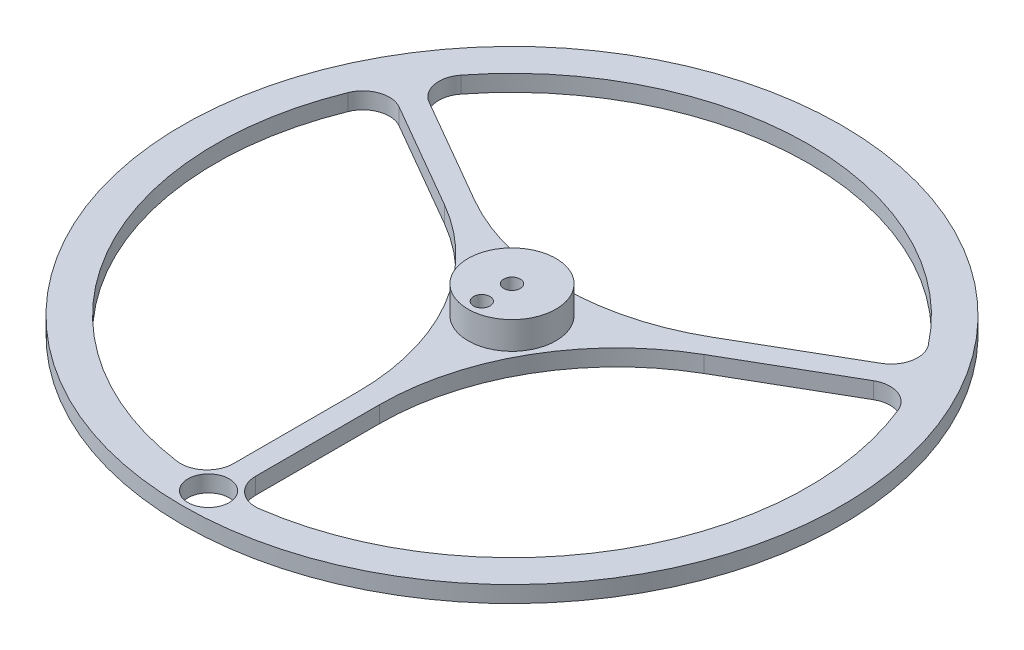
ISO-10303-21;
HEADER;
FILE_DESCRIPTION(('STEP AP214'),'2;1');
FILE_NAME('part.step','',(''),(''),'','','');
FILE_SCHEMA(('AUTOMOTIVE_DESIGN { 1 0 10303 214 1 1 1 1 }'));
ENDSEC;
DATA;
#1=APPLICATION_CONTEXT('core data for automotive mechanical design processes');
#2=APPLICATION_PROTOCOL_DEFINITION('international standard','automotive_design',2000,#1);
#3=PRODUCT_CONTEXT('',#1,'mechanical');
#4=PRODUCT('Part','Part','',(#3));
#5=PRODUCT_RELATED_PRODUCT_CATEGORY('part','',(#4));
#6=PRODUCT_DEFINITION_FORMATION('','',#4);
#7=PRODUCT_DEFINITION_CONTEXT('part definition',#1,'design');
#8=PRODUCT_DEFINITION('design','',#6,#7);
#9=PRODUCT_DEFINITION_SHAPE('','',#8);
#10=(LENGTH_UNIT() NAMED_UNIT(*) SI_UNIT(.MILLI.,.METRE.));
#11=(NAMED_UNIT(*) PLANE_ANGLE_UNIT() SI_UNIT($,.RADIAN.));
#12=(NAMED_UNIT(*) SI_UNIT($,.STERADIAN.) SOLID_ANGLE_UNIT());
#13=UNCERTAINTY_MEASURE_WITH_UNIT(LENGTH_MEASURE(1.E-05),#10,'distance_accuracy_value','');
#14=(GEOMETRIC_REPRESENTATION_CONTEXT(3) GLOBAL_UNCERTAINTY_ASSIGNED_CONTEXT((#13)) GLOBAL_UNIT_ASSIGNED_CONTEXT((#10,
#11,#12)) REPRESENTATION_CONTEXT('',''));
#15=CARTESIAN_POINT('',(0.,0.,0.));
#16=DIRECTION('',(0.,0.,1.));
#17=DIRECTION('',(1.,0.,0.));
#18=AXIS2_PLACEMENT_3D('',#15,#16,#17);
#19=CARTESIAN_POINT('',(-132.141421356237,0.,0.));
#20=DIRECTION('',(0.,1.,0.));
#21=DIRECTION('',(0.,0.,1.));
#22=AXIS2_PLACEMENT_3D('',#19,#20,#21);
#23=PLANE('',#22);
#24=CARTESIAN_POINT('',(0.,0.,55.25));
#25=DIRECTION('',(0.,1.,0.));
#26=DIRECTION('',(0.,0.,1.));
#27=AXIS2_PLACEMENT_3D('',#24,#25,#26);
#28=CIRCLE('',#27,3.75);
#29=CARTESIAN_POINT('',(0.,0.,59.));
#30=VERTEX_POINT('',#29);
#31=EDGE_CURVE('E511',#30,#30,#28,.T.);
#32=ORIENTED_EDGE('',*,*,#31,.F.);
#33=EDGE_LOOP('',(#32));
#34=FACE_BOUND('',#33,.T.);
#35=CARTESIAN_POINT('',(0.,0.,0.));
#36=DIRECTION('',(0.,1.,0.));
#37=DIRECTION('',(0.,0.,1.));
#38=AXIS2_PLACEMENT_3D('',#35,#36,#37);
#39=CIRCLE('',#38,60.);
#40=CARTESIAN_POINT('',(0.,0.,60.));
#41=VERTEX_POINT('',#40);
#42=EDGE_CURVE('E251',#41,#41,#39,.T.);
#43=ORIENTED_EDGE('',*,*,#42,.T.);
#44=EDGE_LOOP('',(#43));
#45=FACE_BOUND('',#44,.T.);
#46=CARTESIAN_POINT('',(0.,0.,0.));
#47=DIRECTION('',(0.,1.,0.));
#48=DIRECTION('',(0.,0.,1.));
#49=AXIS2_PLACEMENT_3D('',#46,#47,#48);
#50=CIRCLE('',#49,54.);
#51=CARTESIAN_POINT('',(-50.0621204437888,0.,-20.2431246765806));
#52=VERTEX_POINT('',#51);
#53=CARTESIAN_POINT('',(-7.5,0.,53.4766304099277));
#54=VERTEX_POINT('',#53);
#55=EDGE_CURVE('E214',#52,#54,#50,.T.);
#56=ORIENTED_EDGE('',*,*,#55,.F.);
#57=CARTESIAN_POINT('',(-45.5850204078836,0.,-18.4327640004259));
#58=DIRECTION('',(0.,1.,0.));
#59=DIRECTION('',(0.,0.,1.));
#60=AXIS2_PLACEMENT_3D('',#57,#58,#59);
#61=CIRCLE('',#60,4.82926811321019);
#62=CARTESIAN_POINT('',(-43.1703863512785,0.,-22.6150328681521));
#63=VERTEX_POINT('',#62);
#64=EDGE_CURVE('E240',#63,#52,#61,.T.);
#65=ORIENTED_EDGE('',*,*,#64,.F.);
#66=DIRECTION('',(0.866025403784437,0.,0.500000000000002));
#67=VECTOR('',#66,1.);
#68=CARTESIAN_POINT('',(-100.106066119377,0.,-55.4868629087586));
#69=LINE('',#68,#67);
#70=CARTESIAN_POINT('',(-23.6243550945525,0.,-11.3301264604924));
#71=VERTEX_POINT('',#70);
#72=EDGE_CURVE('E242',#63,#71,#69,.T.);
#73=ORIENTED_EDGE('',*,*,#72,.T.);
#74=CARTESIAN_POINT('',(-45.2487099847053,0.,26.124354890153));
#75=DIRECTION('',(0.,1.,0.));
#76=DIRECTION('',(0.,0.,1.));
#77=AXIS2_PLACEMENT_3D('',#74,#75,#76);
#78=CIRCLE('',#77,43.2487097803058);
#79=CARTESIAN_POINT('',(-2.0000002043995,0.,26.1243548901531));
#80=VERTEX_POINT('',#79);
#81=EDGE_CURVE('E245',#80,#71,#78,.T.);
#82=ORIENTED_EDGE('',*,*,#81,.F.);
#83=DIRECTION('',(0.,0.,1.));
#84=VECTOR('',#83,1.);
#85=CARTESIAN_POINT('',(-2.0000002043995,0.,0.));
#86=LINE('',#85,#84);
#87=CARTESIAN_POINT('',(-2.0000002043995,0.,48.6941677054723));
#88=VERTEX_POINT('',#87);
#89=EDGE_CURVE('E186',#80,#88,#86,.T.);
#90=ORIENTED_EDGE('',*,*,#89,.T.);
#91=CARTESIAN_POINT('',(-6.8292683176097,0.,48.6941677054723));
#92=DIRECTION('',(0.,1.,0.));
#93=DIRECTION('',(0.,0.,1.));
#94=AXIS2_PLACEMENT_3D('',#91,#92,#93);
#95=CIRCLE('',#94,4.82926811321019);
#96=EDGE_CURVE('E248',#88,#54,#95,.F.);
#97=ORIENTED_EDGE('',*,*,#96,.T.);
#98=EDGE_LOOP('',(#56,#65,#73,#82,#90,#97));
#99=FACE_BOUND('',#98,.T.);
#100=CARTESIAN_POINT('',(42.5621204437888,0.,-33.2335057333471));
#101=VERTEX_POINT('',#100);
#102=CARTESIAN_POINT('',(-42.5621204437888,0.,-33.2335057333471));
#103=VERTEX_POINT('',#102);
#104=EDGE_CURVE('E215',#101,#103,#50,.T.);
#105=ORIENTED_EDGE('',*,*,#104,.F.);
#106=CARTESIAN_POINT('',(38.755752090274,0.,-30.2614037050463));
#107=DIRECTION('',(0.,1.,0.));
#108=DIRECTION('',(0.,0.,1.));
#109=AXIS2_PLACEMENT_3D('',#106,#107,#108);
#110=CIRCLE('',#109,4.82926811321023);
#111=CARTESIAN_POINT('',(41.1703861468791,0.,-26.0791348373201));
#112=VERTEX_POINT('',#111);
#113=EDGE_CURVE('E229',#112,#101,#110,.T.);
#114=ORIENTED_EDGE('',*,*,#113,.F.);
#115=DIRECTION('',(0.86602540378444,0.,-0.499999999999999));
#116=VECTOR('',#115,1.);
#117=CARTESIAN_POINT('',(-100.106066119378,0.,55.4868629087584));
#118=LINE('',#117,#116);
#119=CARTESIAN_POINT('',(21.624354890153,0.,-14.7942284296605));
#120=VERTEX_POINT('',#119);
#121=EDGE_CURVE('E231',#120,#112,#118,.T.);
#122=ORIENTED_EDGE('',*,*,#121,.F.);
#123=CARTESIAN_POINT('',(0.,0.,-52.2487097803058));
#124=DIRECTION('',(0.,1.,0.));
#125=DIRECTION('',(0.,0.,1.));
#126=AXIS2_PLACEMENT_3D('',#123,#124,#125);
#127=CIRCLE('',#126,43.2487097803058);
#128=CARTESIAN_POINT('',(-21.624354890153,0.,-14.7942284296605));
#129=VERTEX_POINT('',#128);
#130=EDGE_CURVE('E233',#129,#120,#127,.T.);
#131=ORIENTED_EDGE('',*,*,#130,.F.);
#132=DIRECTION('',(0.866025403784438,0.,0.500000000000002));
#133=VECTOR('',#132,1.);
#134=CARTESIAN_POINT('',(-98.1060659149781,0.,-58.9509648779266));
#135=LINE('',#134,#133);
#136=CARTESIAN_POINT('',(-41.170386146879,0.,-26.0791348373202));
#137=VERTEX_POINT('',#136);
#138=EDGE_CURVE('E235',#137,#129,#135,.T.);
#139=ORIENTED_EDGE('',*,*,#138,.F.);
#140=CARTESIAN_POINT('',(-38.7557520902739,0.,-30.2614037050463));
#141=DIRECTION('',(0.,1.,0.));
#142=DIRECTION('',(0.,0.,1.));
#143=AXIS2_PLACEMENT_3D('',#140,#141,#142);
#144=CIRCLE('',#143,4.82926811321019);
#145=EDGE_CURVE('E237',#137,#103,#144,.F.);
#146=ORIENTED_EDGE('',*,*,#145,.T.);
#147=EDGE_LOOP('',(#105,#114,#122,#131,#139,#146));
#148=FACE_BOUND('',#147,.T.);
#149=CARTESIAN_POINT('',(7.5,0.,53.4766304099277));
#150=VERTEX_POINT('',#149);
#151=CARTESIAN_POINT('',(50.0621204437888,0.,-20.2431246765805));
#152=VERTEX_POINT('',#151);
#153=EDGE_CURVE('E209',#150,#152,#50,.T.);
#154=ORIENTED_EDGE('',*,*,#153,.F.);
#155=CARTESIAN_POINT('',(6.8292683176097,0.,48.6941677054723));
#156=DIRECTION('',(0.,1.,0.));
#157=DIRECTION('',(0.,0.,1.));
#158=AXIS2_PLACEMENT_3D('',#155,#156,#157);
#159=CIRCLE('',#158,4.82926811321019);
#160=CARTESIAN_POINT('',(2.0000002043995,0.,48.6941677054723));
#161=VERTEX_POINT('',#160);
#162=EDGE_CURVE('E212',#161,#150,#159,.T.);
#163=ORIENTED_EDGE('',*,*,#162,.F.);
#164=DIRECTION('',(0.,0.,-1.));
#165=VECTOR('',#164,1.);
#166=CARTESIAN_POINT('',(2.0000002043995,0.,0.));
#167=LINE('',#166,#165);
#168=CARTESIAN_POINT('',(2.0000002043995,0.,26.1243548901531));
#169=VERTEX_POINT('',#168);
#170=EDGE_CURVE('E217',#161,#169,#167,.T.);
#171=ORIENTED_EDGE('',*,*,#170,.T.);
#172=CARTESIAN_POINT('',(45.2487099847054,0.,26.124354890153));
#173=DIRECTION('',(0.,1.,0.));
#174=DIRECTION('',(0.,0.,1.));
#175=AXIS2_PLACEMENT_3D('',#172,#173,#174);
#176=CIRCLE('',#175,43.2487097803058);
#177=CARTESIAN_POINT('',(23.6243550945525,0.,-11.3301264604924));
#178=VERTEX_POINT('',#177);
#179=EDGE_CURVE('E220',#178,#169,#176,.T.);
#180=ORIENTED_EDGE('',*,*,#179,.F.);
#181=DIRECTION('',(0.866025403784439,0.,-0.5));
#182=VECTOR('',#181,1.);
#183=CARTESIAN_POINT('',(-98.1060659149782,0.,58.9509648779266));
#184=LINE('',#183,#182);
#185=CARTESIAN_POINT('',(43.1703863512786,0.,-22.615032868152));
#186=VERTEX_POINT('',#185);
#187=EDGE_CURVE('E223',#178,#186,#184,.T.);
#188=ORIENTED_EDGE('',*,*,#187,.T.);
#189=CARTESIAN_POINT('',(45.5850204078837,0.,-18.4327640004259));
#190=DIRECTION('',(0.,1.,0.));
#191=DIRECTION('',(0.,0.,1.));
#192=AXIS2_PLACEMENT_3D('',#189,#190,#191);
#193=CIRCLE('',#192,4.8292681132102);
#194=EDGE_CURVE('E226',#186,#152,#193,.F.);
#195=ORIENTED_EDGE('',*,*,#194,.T.);
#196=EDGE_LOOP('',(#154,#163,#171,#180,#188,#195));
#197=FACE_BOUND('',#196,.T.);
#198=CARTESIAN_POINT('',(0.,0.,0.));
#199=DIRECTION('',(0.,1.,0.));
#200=DIRECTION('',(0.,0.,1.));
#201=AXIS2_PLACEMENT_3D('',#198,#199,#200);
#202=CIRCLE('',#201,8.);
#203=CARTESIAN_POINT('',(0.,0.,8.));
#204=VERTEX_POINT('',#203);
#205=EDGE_CURVE('E528',#204,#204,#202,.T.);
#206=ORIENTED_EDGE('',*,*,#205,.F.);
#207=EDGE_LOOP('',(#206));
#208=FACE_BOUND('',#207,.T.);
#209=ADVANCED_FACE('F48',(#34,#45,#99,#148,#197,#208),#23,.T.);
#210=CARTESIAN_POINT('',(0.,-3.,0.));
#211=DIRECTION('',(0.,1.,0.));
#212=DIRECTION('',(0.,0.,1.));
#213=AXIS2_PLACEMENT_3D('',#210,#211,#212);
#214=CYLINDRICAL_SURFACE('',#213,54.);
#215=ORIENTED_EDGE('',*,*,#55,.T.);
#216=DIRECTION('',(0.,1.,0.));
#217=VECTOR('',#216,1.);
#218=CARTESIAN_POINT('',(-7.5,-3.,53.4766304099277));
#219=LINE('',#218,#217);
#220=CARTESIAN_POINT('',(-7.5,-3.,53.4766304099277));
#221=VERTEX_POINT('',#220);
#222=EDGE_CURVE('E13',#221,#54,#219,.T.);
#223=ORIENTED_EDGE('',*,*,#222,.F.);
#224=CARTESIAN_POINT('',(0.,-3.,0.));
#225=DIRECTION('',(0.,1.,0.));
#226=DIRECTION('',(0.,0.,1.));
#227=AXIS2_PLACEMENT_3D('',#224,#225,#226);
#228=CIRCLE('',#227,54.);
#229=CARTESIAN_POINT('',(-50.0621204437888,-3.,-20.2431246765806));
#230=VERTEX_POINT('',#229);
#231=EDGE_CURVE('E67',#230,#221,#228,.T.);
#232=ORIENTED_EDGE('',*,*,#231,.F.);
#233=DIRECTION('',(0.,1.,0.));
#234=VECTOR('',#233,1.);
#235=CARTESIAN_POINT('',(-50.0621204437888,-3.,-20.2431246765806));
#236=LINE('',#235,#234);
#237=EDGE_CURVE('E259',#230,#52,#236,.T.);
#238=ORIENTED_EDGE('',*,*,#237,.T.);
#239=EDGE_LOOP('',(#215,#223,#232,#238));
#240=FACE_BOUND('',#239,.T.);
#241=ADVANCED_FACE('F337',(#240),#214,.F.);
#242=CARTESIAN_POINT('',(-6.8292683176097,-3.,48.6941677054723));
#243=DIRECTION('',(0.,1.,0.));
#244=DIRECTION('',(0.,0.,1.));
#245=AXIS2_PLACEMENT_3D('',#242,#243,#244);
#246=CYLINDRICAL_SURFACE('',#245,4.82926811321019);
#247=ORIENTED_EDGE('',*,*,#96,.F.);
#248=DIRECTION('',(0.,1.,0.));
#249=VECTOR('',#248,1.);
#250=CARTESIAN_POINT('',(-2.0000002043995,-3.,48.6941677054723));
#251=LINE('',#250,#249);
#252=CARTESIAN_POINT('',(-2.0000002043995,-3.,48.6941677054723));
#253=VERTEX_POINT('',#252);
#254=EDGE_CURVE('E58',#253,#88,#251,.T.);
#255=ORIENTED_EDGE('',*,*,#254,.F.);
#256=CARTESIAN_POINT('',(-6.8292683176097,-3.,48.6941677054723));
#257=DIRECTION('',(0.,1.,0.));
#258=DIRECTION('',(0.,0.,1.));
#259=AXIS2_PLACEMENT_3D('',#256,#257,#258);
#260=CIRCLE('',#259,4.82926811321019);
#261=EDGE_CURVE('E201',#253,#221,#260,.F.);
#262=ORIENTED_EDGE('',*,*,#261,.T.);
#263=ORIENTED_EDGE('',*,*,#222,.T.);
#264=EDGE_LOOP('',(#247,#255,#262,#263));
#265=FACE_BOUND('',#264,.T.);
#266=ADVANCED_FACE('F367',(#265),#246,.F.);
#267=CARTESIAN_POINT('',(-2.0000002043995,-3.,0.));
#268=DIRECTION('',(-1.,0.,0.));
#269=DIRECTION('',(0.,0.,1.));
#270=AXIS2_PLACEMENT_3D('',#267,#268,#269);
#271=PLANE('',#270);
#272=ORIENTED_EDGE('',*,*,#89,.F.);
#273=DIRECTION('',(0.,1.,0.));
#274=VECTOR('',#273,1.);
#275=CARTESIAN_POINT('',(-2.0000002043995,-3.,26.1243548901531));
#276=LINE('',#275,#274);
#277=CARTESIAN_POINT('',(-2.0000002043995,-3.,26.1243548901531));
#278=VERTEX_POINT('',#277);
#279=EDGE_CURVE('E181',#278,#80,#276,.T.);
#280=ORIENTED_EDGE('',*,*,#279,.F.);
#281=DIRECTION('',(0.,0.,1.));
#282=VECTOR('',#281,1.);
#283=CARTESIAN_POINT('',(-2.0000002043995,-3.,0.));
#284=LINE('',#283,#282);
#285=EDGE_CURVE('E185',#278,#253,#284,.T.);
#286=ORIENTED_EDGE('',*,*,#285,.T.);
#287=ORIENTED_EDGE('',*,*,#254,.T.);
#288=EDGE_LOOP('',(#272,#280,#286,#287));
#289=FACE_BOUND('',#288,.T.);
#290=ADVANCED_FACE('F183',(#289),#271,.T.);
#291=CARTESIAN_POINT('',(-45.2487099847053,-3.,26.124354890153));
#292=DIRECTION('',(0.,1.,0.));
#293=DIRECTION('',(0.,0.,1.));
#294=AXIS2_PLACEMENT_3D('',#291,#292,#293);
#295=CYLINDRICAL_SURFACE('',#294,43.2487097803058);
#296=ORIENTED_EDGE('',*,*,#81,.T.);
#297=DIRECTION('',(0.,1.,0.));
#298=VECTOR('',#297,1.);
#299=CARTESIAN_POINT('',(-23.6243550945525,-3.,-11.3301264604924));
#300=LINE('',#299,#298);
#301=CARTESIAN_POINT('',(-23.6243550945525,-3.,-11.3301264604924));
#302=VERTEX_POINT('',#301);
#303=EDGE_CURVE('E190',#302,#71,#300,.T.);
#304=ORIENTED_EDGE('',*,*,#303,.F.);
#305=CARTESIAN_POINT('',(-45.2487099847053,-3.,26.124354890153));
#306=DIRECTION('',(0.,1.,0.));
#307=DIRECTION('',(0.,0.,1.));
#308=AXIS2_PLACEMENT_3D('',#305,#306,#307);
#309=CIRCLE('',#308,43.2487097803058);
#310=EDGE_CURVE('E193',#278,#302,#309,.T.);
#311=ORIENTED_EDGE('',*,*,#310,.F.);
#312=ORIENTED_EDGE('',*,*,#279,.T.);
#313=EDGE_LOOP('',(#296,#304,#311,#312));
#314=FACE_BOUND('',#313,.T.);
#315=ADVANCED_FACE('F194',(#314),#295,.F.);
#316=CARTESIAN_POINT('',(-100.106066119377,-3.,-55.4868629087586));
#317=DIRECTION('',(-0.500000000000002,0.,0.866025403784437));
#318=DIRECTION('',(0.866025403784437,0.,0.500000000000002));
#319=AXIS2_PLACEMENT_3D('',#316,#317,#318);
#320=PLANE('',#319);
#321=ORIENTED_EDGE('',*,*,#72,.F.);
#322=DIRECTION('',(0.,1.,0.));
#323=VECTOR('',#322,1.);
#324=CARTESIAN_POINT('',(-43.1703863512785,-3.,-22.6150328681521));
#325=LINE('',#324,#323);
#326=CARTESIAN_POINT('',(-43.1703863512785,-3.,-22.6150328681521));
#327=VERTEX_POINT('',#326);
#328=EDGE_CURVE('E257',#327,#63,#325,.T.);
#329=ORIENTED_EDGE('',*,*,#328,.F.);
#330=DIRECTION('',(0.866025403784437,0.,0.500000000000002));
#331=VECTOR('',#330,1.);
#332=CARTESIAN_POINT('',(-100.106066119377,-3.,-55.4868629087586));
#333=LINE('',#332,#331);
#334=EDGE_CURVE('E197',#327,#302,#333,.T.);
#335=ORIENTED_EDGE('',*,*,#334,.T.);
#336=ORIENTED_EDGE('',*,*,#303,.T.);
#337=EDGE_LOOP('',(#321,#329,#335,#336));
#338=FACE_BOUND('',#337,.T.);
#339=ADVANCED_FACE('F329',(#338),#320,.T.);
#340=ORIENTED_EDGE('',*,*,#104,.T.);
#341=DIRECTION('',(0.,1.,0.));
#342=VECTOR('',#341,1.);
#343=CARTESIAN_POINT('',(-42.5621204437888,-3.,-33.2335057333471));
#344=LINE('',#343,#342);
#345=CARTESIAN_POINT('',(-42.5621204437888,-3.,-33.2335057333471));
#346=VERTEX_POINT('',#345);
#347=EDGE_CURVE('E262',#346,#103,#344,.T.);
#348=ORIENTED_EDGE('',*,*,#347,.F.);
#349=CARTESIAN_POINT('',(42.5621204437888,-3.,-33.2335057333471));
#350=VERTEX_POINT('',#349);
#351=EDGE_CURVE('E307',#350,#346,#228,.T.);
#352=ORIENTED_EDGE('',*,*,#351,.F.);
#353=DIRECTION('',(0.,1.,0.));
#354=VECTOR('',#353,1.);
#355=CARTESIAN_POINT('',(42.5621204437888,-3.,-33.2335057333471));
#356=LINE('',#355,#354);
#357=EDGE_CURVE('E275',#350,#101,#356,.T.);
#358=ORIENTED_EDGE('',*,*,#357,.T.);
#359=EDGE_LOOP('',(#340,#348,#352,#358));
#360=FACE_BOUND('',#359,.T.);
#361=ADVANCED_FACE('F369',(#360),#214,.F.);
#362=CARTESIAN_POINT('',(-38.7557520902739,-3.,-30.2614037050463));
#363=DIRECTION('',(0.,1.,0.));
#364=DIRECTION('',(0.,0.,1.));
#365=AXIS2_PLACEMENT_3D('',#362,#363,#364);
#366=CYLINDRICAL_SURFACE('',#365,4.82926811321019);
#367=ORIENTED_EDGE('',*,*,#145,.F.);
#368=DIRECTION('',(0.,1.,0.));
#369=VECTOR('',#368,1.);
#370=CARTESIAN_POINT('',(-41.170386146879,-3.,-26.0791348373202));
#371=LINE('',#370,#369);
#372=CARTESIAN_POINT('',(-41.170386146879,-3.,-26.0791348373202));
#373=VERTEX_POINT('',#372);
#374=EDGE_CURVE('E264',#373,#137,#371,.T.);
#375=ORIENTED_EDGE('',*,*,#374,.F.);
#376=CARTESIAN_POINT('',(-38.7557520902739,-3.,-30.2614037050463));
#377=DIRECTION('',(0.,1.,0.));
#378=DIRECTION('',(0.,0.,1.));
#379=AXIS2_PLACEMENT_3D('',#376,#377,#378);
#380=CIRCLE('',#379,4.82926811321019);
#381=EDGE_CURVE('E323',#373,#346,#380,.F.);
#382=ORIENTED_EDGE('',*,*,#381,.T.);
#383=ORIENTED_EDGE('',*,*,#347,.T.);
#384=EDGE_LOOP('',(#367,#375,#382,#383));
#385=FACE_BOUND('',#384,.T.);
#386=ADVANCED_FACE('F385',(#385),#366,.F.);
#387=CARTESIAN_POINT('',(-98.1060659149781,-3.,-58.9509648779266));
#388=DIRECTION('',(-0.500000000000001,0.,0.866025403784438));
#389=DIRECTION('',(0.866025403784438,0.,0.500000000000002));
#390=AXIS2_PLACEMENT_3D('',#387,#388,#389);
#391=PLANE('',#390);
#392=ORIENTED_EDGE('',*,*,#138,.T.);
#393=DIRECTION('',(0.,1.,0.));
#394=VECTOR('',#393,1.);
#395=CARTESIAN_POINT('',(-21.624354890153,-3.,-14.7942284296605));
#396=LINE('',#395,#394);
#397=CARTESIAN_POINT('',(-21.624354890153,-3.,-14.7942284296605));
#398=VERTEX_POINT('',#397);
#399=EDGE_CURVE('E266',#398,#129,#396,.T.);
#400=ORIENTED_EDGE('',*,*,#399,.F.);
#401=DIRECTION('',(0.866025403784438,0.,0.500000000000002));
#402=VECTOR('',#401,1.);
#403=CARTESIAN_POINT('',(-98.1060659149781,-3.,-58.9509648779266));
#404=LINE('',#403,#402);
#405=EDGE_CURVE('E321',#373,#398,#404,.T.);
#406=ORIENTED_EDGE('',*,*,#405,.F.);
#407=ORIENTED_EDGE('',*,*,#374,.T.);
#408=EDGE_LOOP('',(#392,#400,#406,#407));
#409=FACE_BOUND('',#408,.T.);
#410=ADVANCED_FACE('F388',(#409),#391,.F.);
#411=CARTESIAN_POINT('',(0.,-3.,-52.2487097803058));
#412=DIRECTION('',(0.,1.,0.));
#413=DIRECTION('',(0.,0.,1.));
#414=AXIS2_PLACEMENT_3D('',#411,#412,#413);
#415=CYLINDRICAL_SURFACE('',#414,43.2487097803058);
#416=ORIENTED_EDGE('',*,*,#130,.T.);
#417=DIRECTION('',(0.,1.,0.));
#418=VECTOR('',#417,1.);
#419=CARTESIAN_POINT('',(21.624354890153,-3.,-14.7942284296605));
#420=LINE('',#419,#418);
#421=CARTESIAN_POINT('',(21.624354890153,-3.,-14.7942284296605));
#422=VERTEX_POINT('',#421);
#423=EDGE_CURVE('E269',#422,#120,#420,.T.);
#424=ORIENTED_EDGE('',*,*,#423,.F.);
#425=CARTESIAN_POINT('',(0.,-3.,-52.2487097803058));
#426=DIRECTION('',(0.,1.,0.));
#427=DIRECTION('',(0.,0.,1.));
#428=AXIS2_PLACEMENT_3D('',#425,#426,#427);
#429=CIRCLE('',#428,43.2487097803058);
#430=EDGE_CURVE('E319',#398,#422,#429,.T.);
#431=ORIENTED_EDGE('',*,*,#430,.F.);
#432=ORIENTED_EDGE('',*,*,#399,.T.);
#433=EDGE_LOOP('',(#416,#424,#431,#432));
#434=FACE_BOUND('',#433,.T.);
#435=ADVANCED_FACE('F392',(#434),#415,.F.);
#436=CARTESIAN_POINT('',(-100.106066119378,-3.,55.4868629087584));
#437=DIRECTION('',(0.499999999999999,0.,0.866025403784439));
#438=DIRECTION('',(0.866025403784439,0.,-0.499999999999999));
#439=AXIS2_PLACEMENT_3D('',#436,#437,#438);
#440=PLANE('',#439);
#441=ORIENTED_EDGE('',*,*,#121,.T.);
#442=DIRECTION('',(0.,1.,0.));
#443=VECTOR('',#442,1.);
#444=CARTESIAN_POINT('',(41.1703861468791,-3.,-26.0791348373201));
#445=LINE('',#444,#443);
#446=CARTESIAN_POINT('',(41.1703861468791,-3.,-26.0791348373201));
#447=VERTEX_POINT('',#446);
#448=EDGE_CURVE('E272',#447,#112,#445,.T.);
#449=ORIENTED_EDGE('',*,*,#448,.F.);
#450=DIRECTION('',(0.86602540378444,0.,-0.499999999999999));
#451=VECTOR('',#450,1.);
#452=CARTESIAN_POINT('',(-100.106066119378,-3.,55.4868629087584));
#453=LINE('',#452,#451);
#454=EDGE_CURVE('E317',#422,#447,#453,.T.);
#455=ORIENTED_EDGE('',*,*,#454,.F.);
#456=ORIENTED_EDGE('',*,*,#423,.T.);
#457=EDGE_LOOP('',(#441,#449,#455,#456));
#458=FACE_BOUND('',#457,.T.);
#459=ADVANCED_FACE('F396',(#458),#440,.F.);
#460=ORIENTED_EDGE('',*,*,#153,.T.);
#461=DIRECTION('',(0.,1.,0.));
#462=VECTOR('',#461,1.);
#463=CARTESIAN_POINT('',(50.0621204437888,-3.,-20.2431246765805));
#464=LINE('',#463,#462);
#465=CARTESIAN_POINT('',(50.0621204437888,-3.,-20.2431246765805));
#466=VERTEX_POINT('',#465);
#467=EDGE_CURVE('E278',#466,#152,#464,.T.);
#468=ORIENTED_EDGE('',*,*,#467,.F.);
#469=CARTESIAN_POINT('',(7.5,-3.,53.4766304099277));
#470=VERTEX_POINT('',#469);
#471=EDGE_CURVE('E253',#470,#466,#228,.T.);
#472=ORIENTED_EDGE('',*,*,#471,.F.);
#473=DIRECTION('',(0.,1.,0.));
#474=VECTOR('',#473,1.);
#475=CARTESIAN_POINT('',(7.5,-3.,53.4766304099277));
#476=LINE('',#475,#474);
#477=EDGE_CURVE('E52',#470,#150,#476,.T.);
#478=ORIENTED_EDGE('',*,*,#477,.T.);
#479=EDGE_LOOP('',(#460,#468,#472,#478));
#480=FACE_BOUND('',#479,.T.);
#481=ADVANCED_FACE('F292',(#480),#214,.F.);
#482=CARTESIAN_POINT('',(45.5850204078837,-3.,-18.4327640004259));
#483=DIRECTION('',(0.,1.,0.));
#484=DIRECTION('',(0.,0.,1.));
#485=AXIS2_PLACEMENT_3D('',#482,#483,#484);
#486=CYLINDRICAL_SURFACE('',#485,4.8292681132102);
#487=ORIENTED_EDGE('',*,*,#194,.F.);
#488=DIRECTION('',(0.,1.,0.));
#489=VECTOR('',#488,1.);
#490=CARTESIAN_POINT('',(43.1703863512786,-3.,-22.615032868152));
#491=LINE('',#490,#489);
#492=CARTESIAN_POINT('',(43.1703863512786,-3.,-22.615032868152));
#493=VERTEX_POINT('',#492);
#494=EDGE_CURVE('E280',#493,#186,#491,.T.);
#495=ORIENTED_EDGE('',*,*,#494,.F.);
#496=CARTESIAN_POINT('',(45.5850204078837,-3.,-18.4327640004259));
#497=DIRECTION('',(0.,1.,0.));
#498=DIRECTION('',(0.,0.,1.));
#499=AXIS2_PLACEMENT_3D('',#496,#497,#498);
#500=CIRCLE('',#499,4.8292681132102);
#501=EDGE_CURVE('E305',#493,#466,#500,.F.);
#502=ORIENTED_EDGE('',*,*,#501,.T.);
#503=ORIENTED_EDGE('',*,*,#467,.T.);
#504=EDGE_LOOP('',(#487,#495,#502,#503));
#505=FACE_BOUND('',#504,.T.);
#506=ADVANCED_FACE('F301',(#505),#486,.F.);
#507=CARTESIAN_POINT('',(-98.1060659149782,-3.,58.9509648779266));
#508=DIRECTION('',(0.5,0.,0.866025403784439));
#509=DIRECTION('',(0.866025403784439,0.,-0.5));
#510=AXIS2_PLACEMENT_3D('',#507,#508,#509);
#511=PLANE('',#510);
#512=ORIENTED_EDGE('',*,*,#187,.F.);
#513=DIRECTION('',(0.,1.,0.));
#514=VECTOR('',#513,1.);
#515=CARTESIAN_POINT('',(23.6243550945525,-3.,-11.3301264604924));
#516=LINE('',#515,#514);
#517=CARTESIAN_POINT('',(23.6243550945525,-3.,-11.3301264604924));
#518=VERTEX_POINT('',#517);
#519=EDGE_CURVE('E282',#518,#178,#516,.T.);
#520=ORIENTED_EDGE('',*,*,#519,.F.);
#521=DIRECTION('',(0.866025403784439,0.,-0.5));
#522=VECTOR('',#521,1.);
#523=CARTESIAN_POINT('',(-98.1060659149782,-3.,58.9509648779266));
#524=LINE('',#523,#522);
#525=EDGE_CURVE('E308',#518,#493,#524,.T.);
#526=ORIENTED_EDGE('',*,*,#525,.T.);
#527=ORIENTED_EDGE('',*,*,#494,.T.);
#528=EDGE_LOOP('',(#512,#520,#526,#527));
#529=FACE_BOUND('',#528,.T.);
#530=ADVANCED_FACE('F403',(#529),#511,.T.);
#531=CARTESIAN_POINT('',(45.2487099847054,-3.,26.124354890153));
#532=DIRECTION('',(0.,1.,0.));
#533=DIRECTION('',(0.,0.,1.));
#534=AXIS2_PLACEMENT_3D('',#531,#532,#533);
#535=CYLINDRICAL_SURFACE('',#534,43.2487097803058);
#536=ORIENTED_EDGE('',*,*,#179,.T.);
#537=DIRECTION('',(0.,1.,0.));
#538=VECTOR('',#537,1.);
#539=CARTESIAN_POINT('',(2.0000002043995,-3.,26.1243548901531));
#540=LINE('',#539,#538);
#541=CARTESIAN_POINT('',(2.0000002043995,-3.,26.1243548901531));
#542=VERTEX_POINT('',#541);
#543=EDGE_CURVE('E284',#542,#169,#540,.T.);
#544=ORIENTED_EDGE('',*,*,#543,.F.);
#545=CARTESIAN_POINT('',(45.2487099847054,-3.,26.124354890153));
#546=DIRECTION('',(0.,1.,0.));
#547=DIRECTION('',(0.,0.,1.));
#548=AXIS2_PLACEMENT_3D('',#545,#546,#547);
#549=CIRCLE('',#548,43.2487097803058);
#550=EDGE_CURVE('E312',#518,#542,#549,.T.);
#551=ORIENTED_EDGE('',*,*,#550,.F.);
#552=ORIENTED_EDGE('',*,*,#519,.T.);
#553=EDGE_LOOP('',(#536,#544,#551,#552));
#554=FACE_BOUND('',#553,.T.);
#555=ADVANCED_FACE('F347',(#554),#535,.F.);
#556=CARTESIAN_POINT('',(2.0000002043995,-3.,0.));
#557=DIRECTION('',(1.,0.,0.));
#558=DIRECTION('',(0.,0.,-1.));
#559=AXIS2_PLACEMENT_3D('',#556,#557,#558);
#560=PLANE('',#559);
#561=ORIENTED_EDGE('',*,*,#170,.F.);
#562=DIRECTION('',(0.,1.,0.));
#563=VECTOR('',#562,1.);
#564=CARTESIAN_POINT('',(2.0000002043995,-3.,48.6941677054723));
#565=LINE('',#564,#563);
#566=CARTESIAN_POINT('',(2.0000002043995,-3.,48.6941677054723));
#567=VERTEX_POINT('',#566);
#568=EDGE_CURVE('E285',#567,#161,#565,.T.);
#569=ORIENTED_EDGE('',*,*,#568,.F.);
#570=DIRECTION('',(0.,0.,-1.));
#571=VECTOR('',#570,1.);
#572=CARTESIAN_POINT('',(2.0000002043995,-3.,0.));
#573=LINE('',#572,#571);
#574=EDGE_CURVE('E340',#567,#542,#573,.T.);
#575=ORIENTED_EDGE('',*,*,#574,.T.);
#576=ORIENTED_EDGE('',*,*,#543,.T.);
#577=EDGE_LOOP('',(#561,#569,#575,#576));
#578=FACE_BOUND('',#577,.T.);
#579=ADVANCED_FACE('F349',(#578),#560,.T.);
#580=CARTESIAN_POINT('',(-45.5850204078836,-3.,-18.4327640004259));
#581=DIRECTION('',(0.,1.,0.));
#582=DIRECTION('',(0.,0.,1.));
#583=AXIS2_PLACEMENT_3D('',#580,#581,#582);
#584=CYLINDRICAL_SURFACE('',#583,4.82926811321019);
#585=ORIENTED_EDGE('',*,*,#64,.T.);
#586=ORIENTED_EDGE('',*,*,#237,.F.);
#587=CARTESIAN_POINT('',(-45.5850204078836,-3.,-18.4327640004259));
#588=DIRECTION('',(0.,1.,0.));
#589=DIRECTION('',(0.,0.,1.));
#590=AXIS2_PLACEMENT_3D('',#587,#588,#589);
#591=CIRCLE('',#590,4.82926811321019);
#592=EDGE_CURVE('E326',#327,#230,#591,.T.);
#593=ORIENTED_EDGE('',*,*,#592,.F.);
#594=ORIENTED_EDGE('',*,*,#328,.T.);
#595=EDGE_LOOP('',(#585,#586,#593,#594));
#596=FACE_BOUND('',#595,.T.);
#597=ADVANCED_FACE('F333',(#596),#584,.F.);
#598=CARTESIAN_POINT('',(38.755752090274,-3.,-30.2614037050463));
#599=DIRECTION('',(0.,1.,0.));
#600=DIRECTION('',(0.,0.,1.));
#601=AXIS2_PLACEMENT_3D('',#598,#599,#600);
#602=CYLINDRICAL_SURFACE('',#601,4.82926811321023);
#603=ORIENTED_EDGE('',*,*,#113,.T.);
#604=ORIENTED_EDGE('',*,*,#357,.F.);
#605=CARTESIAN_POINT('',(38.755752090274,-3.,-30.2614037050463));
#606=DIRECTION('',(0.,1.,0.));
#607=DIRECTION('',(0.,0.,1.));
#608=AXIS2_PLACEMENT_3D('',#605,#606,#607);
#609=CIRCLE('',#608,4.82926811321023);
#610=EDGE_CURVE('E310',#447,#350,#609,.T.);
#611=ORIENTED_EDGE('',*,*,#610,.F.);
#612=ORIENTED_EDGE('',*,*,#448,.T.);
#613=EDGE_LOOP('',(#603,#604,#611,#612));
#614=FACE_BOUND('',#613,.T.);
#615=ADVANCED_FACE('F352',(#614),#602,.F.);
#616=CARTESIAN_POINT('',(6.8292683176097,-3.,48.6941677054723));
#617=DIRECTION('',(0.,1.,0.));
#618=DIRECTION('',(0.,0.,1.));
#619=AXIS2_PLACEMENT_3D('',#616,#617,#618);
#620=CYLINDRICAL_SURFACE('',#619,4.82926811321019);
#621=ORIENTED_EDGE('',*,*,#162,.T.);
#622=ORIENTED_EDGE('',*,*,#477,.F.);
#623=CARTESIAN_POINT('',(6.8292683176097,-3.,48.6941677054723));
#624=DIRECTION('',(0.,1.,0.));
#625=DIRECTION('',(0.,0.,1.));
#626=AXIS2_PLACEMENT_3D('',#623,#624,#625);
#627=CIRCLE('',#626,4.82926811321019);
#628=EDGE_CURVE('E139',#567,#470,#627,.T.);
#629=ORIENTED_EDGE('',*,*,#628,.F.);
#630=ORIENTED_EDGE('',*,*,#568,.T.);
#631=EDGE_LOOP('',(#621,#622,#629,#630));
#632=FACE_BOUND('',#631,.T.);
#633=ADVANCED_FACE('F50',(#632),#620,.F.);
#634=CARTESIAN_POINT('',(0.,-3.,0.));
#635=DIRECTION('',(0.,1.,0.));
#636=DIRECTION('',(0.,0.,1.));
#637=AXIS2_PLACEMENT_3D('',#634,#635,#636);
#638=CYLINDRICAL_SURFACE('',#637,60.);
#639=CARTESIAN_POINT('',(0.,-3.,0.));
#640=DIRECTION('',(0.,1.,0.));
#641=DIRECTION('',(0.,0.,1.));
#642=AXIS2_PLACEMENT_3D('',#639,#640,#641);
#643=CIRCLE('',#642,60.);
#644=CARTESIAN_POINT('',(0.,-3.,60.));
#645=VERTEX_POINT('',#644);
#646=EDGE_CURVE('E203',#645,#645,#643,.T.);
#647=ORIENTED_EDGE('',*,*,#646,.T.);
#648=EDGE_LOOP('',(#647));
#649=FACE_BOUND('',#648,.T.);
#650=ORIENTED_EDGE('',*,*,#42,.F.);
#651=EDGE_LOOP('',(#650));
#652=FACE_BOUND('',#651,.T.);
#653=ADVANCED_FACE('F351',(#649,#652),#638,.T.);
#654=CARTESIAN_POINT('',(-132.141421356237,-3.,0.));
#655=DIRECTION('',(0.,1.,0.));
#656=DIRECTION('',(0.,0.,1.));
#657=AXIS2_PLACEMENT_3D('',#654,#655,#656);
#658=PLANE('',#657);
#659=CARTESIAN_POINT('',(0.,-3.,55.25));
#660=DIRECTION('',(0.,1.,0.));
#661=DIRECTION('',(0.,0.,1.));
#662=AXIS2_PLACEMENT_3D('',#659,#660,#661);
#663=CIRCLE('',#662,3.75);
#664=CARTESIAN_POINT('',(0.,-3.,59.));
#665=VERTEX_POINT('',#664);
#666=EDGE_CURVE('E515',#665,#665,#663,.F.);
#667=ORIENTED_EDGE('',*,*,#666,.F.);
#668=EDGE_LOOP('',(#667));
#669=FACE_BOUND('',#668,.T.);
#670=CARTESIAN_POINT('',(0.,-3.,0.));
#671=DIRECTION('',(0.,1.,0.));
#672=DIRECTION('',(0.,0.,1.));
#673=AXIS2_PLACEMENT_3D('',#670,#671,#672);
#674=CIRCLE('',#673,1.5);
#675=CARTESIAN_POINT('',(0.,-3.,1.5));
#676=VERTEX_POINT('',#675);
#677=EDGE_CURVE('E525',#676,#676,#674,.F.);
#678=ORIENTED_EDGE('',*,*,#677,.F.);
#679=EDGE_LOOP('',(#678));
#680=FACE_BOUND('',#679,.T.);
#681=ORIENTED_EDGE('',*,*,#471,.T.);
#682=ORIENTED_EDGE('',*,*,#501,.F.);
#683=ORIENTED_EDGE('',*,*,#525,.F.);
#684=ORIENTED_EDGE('',*,*,#550,.T.);
#685=ORIENTED_EDGE('',*,*,#574,.F.);
#686=ORIENTED_EDGE('',*,*,#628,.T.);
#687=EDGE_LOOP('',(#681,#682,#683,#684,#685,#686));
#688=FACE_BOUND('',#687,.T.);
#689=ORIENTED_EDGE('',*,*,#351,.T.);
#690=ORIENTED_EDGE('',*,*,#381,.F.);
#691=ORIENTED_EDGE('',*,*,#405,.T.);
#692=ORIENTED_EDGE('',*,*,#430,.T.);
#693=ORIENTED_EDGE('',*,*,#454,.T.);
#694=ORIENTED_EDGE('',*,*,#610,.T.);
#695=EDGE_LOOP('',(#689,#690,#691,#692,#693,#694));
#696=FACE_BOUND('',#695,.T.);
#697=ORIENTED_EDGE('',*,*,#231,.T.);
#698=ORIENTED_EDGE('',*,*,#261,.F.);
#699=ORIENTED_EDGE('',*,*,#285,.F.);
#700=ORIENTED_EDGE('',*,*,#310,.T.);
#701=ORIENTED_EDGE('',*,*,#334,.F.);
#702=ORIENTED_EDGE('',*,*,#592,.T.);
#703=EDGE_LOOP('',(#697,#698,#699,#700,#701,#702));
#704=FACE_BOUND('',#703,.T.);
#705=ORIENTED_EDGE('',*,*,#646,.F.);
#706=EDGE_LOOP('',(#705));
#707=FACE_BOUND('',#706,.T.);
#708=ADVANCED_FACE('F199',(#669,#680,#688,#696,#704,#707),#658,.F.);
#709=CARTESIAN_POINT('',(0.,5.,0.));
#710=DIRECTION('',(0.,-1.,0.));
#711=DIRECTION('',(0.,0.,-1.));
#712=AXIS2_PLACEMENT_3D('',#709,#710,#711);
#713=CYLINDRICAL_SURFACE('',#712,8.);
#714=CARTESIAN_POINT('',(0.,5.,0.));
#715=DIRECTION('',(0.,1.,0.));
#716=DIRECTION('',(0.,0.,1.));
#717=AXIS2_PLACEMENT_3D('',#714,#715,#716);
#718=CIRCLE('',#717,8.);
#719=CARTESIAN_POINT('',(0.,5.,8.));
#720=VERTEX_POINT('',#719);
#721=EDGE_CURVE('E213',#720,#720,#718,.T.);
#722=ORIENTED_EDGE('',*,*,#721,.F.);
#723=EDGE_LOOP('',(#722));
#724=FACE_BOUND('',#723,.T.);
#725=ORIENTED_EDGE('',*,*,#205,.T.);
#726=EDGE_LOOP('',(#725));
#727=FACE_BOUND('',#726,.T.);
#728=ADVANCED_FACE('F438',(#724,#727),#713,.T.);
#729=CARTESIAN_POINT('',(-132.141421356237,5.,0.));
#730=DIRECTION('',(0.,1.,0.));
#731=DIRECTION('',(0.,0.,1.));
#732=AXIS2_PLACEMENT_3D('',#729,#730,#731);
#733=PLANE('',#732);
#734=CARTESIAN_POINT('',(0.,5.,5.5));
#735=DIRECTION('',(0.,1.,0.));
#736=DIRECTION('',(0.,0.,1.));
#737=AXIS2_PLACEMENT_3D('',#734,#735,#736);
#738=CIRCLE('',#737,1.5);
#739=CARTESIAN_POINT('',(0.,5.,7.));
#740=VERTEX_POINT('',#739);
#741=EDGE_CURVE('E512',#740,#740,#738,.T.);
#742=ORIENTED_EDGE('',*,*,#741,.F.);
#743=EDGE_LOOP('',(#742));
#744=FACE_BOUND('',#743,.T.);
#745=CARTESIAN_POINT('',(0.,5.,0.));
#746=DIRECTION('',(0.,1.,0.));
#747=DIRECTION('',(0.,0.,1.));
#748=AXIS2_PLACEMENT_3D('',#745,#746,#747);
#749=CIRCLE('',#748,1.5);
#750=CARTESIAN_POINT('',(0.,5.,1.5));
#751=VERTEX_POINT('',#750);
#752=EDGE_CURVE('E522',#751,#751,#749,.T.);
#753=ORIENTED_EDGE('',*,*,#752,.F.);
#754=EDGE_LOOP('',(#753));
#755=FACE_BOUND('',#754,.T.);
#756=ORIENTED_EDGE('',*,*,#721,.T.);
#757=EDGE_LOOP('',(#756));
#758=FACE_BOUND('',#757,.T.);
#759=ADVANCED_FACE('F443',(#744,#755,#758),#733,.T.);
#760=CARTESIAN_POINT('',(0.,-3.001,0.));
#761=DIRECTION('',(0.,1.,0.));
#762=DIRECTION('',(0.,0.,1.));
#763=AXIS2_PLACEMENT_3D('',#760,#761,#762);
#764=CYLINDRICAL_SURFACE('',#763,1.5);
#765=ORIENTED_EDGE('',*,*,#752,.T.);
#766=EDGE_LOOP('',(#765));
#767=FACE_BOUND('',#766,.T.);
#768=ORIENTED_EDGE('',*,*,#677,.T.);
#769=EDGE_LOOP('',(#768));
#770=FACE_BOUND('',#769,.T.);
#771=ADVANCED_FACE('F451',(#767,#770),#764,.F.);
#772=CARTESIAN_POINT('',(0.,-3.001,55.25));
#773=DIRECTION('',(0.,1.,0.));
#774=DIRECTION('',(0.,0.,1.));
#775=AXIS2_PLACEMENT_3D('',#772,#773,#774);
#776=CYLINDRICAL_SURFACE('',#775,3.75);
#777=CARTESIAN_POINT('',(0.,0.,59.));
#778=CARTESIAN_POINT('',(0.,-0.0312500000000005,59.));
#779=CARTESIAN_POINT('',(0.,-0.0625000000000005,59.));
#780=CARTESIAN_POINT('',(0.,-0.125000000000001,59.));
#781=CARTESIAN_POINT('',(0.,-0.156250000000001,59.));
#782=CARTESIAN_POINT('',(0.,-0.218750000000001,59.));
#783=CARTESIAN_POINT('',(0.,-0.250000000000001,59.));
#784=CARTESIAN_POINT('',(0.,-0.312500000000001,59.));
#785=CARTESIAN_POINT('',(0.,-0.34375,59.));
#786=CARTESIAN_POINT('',(0.,-0.40625,59.));
#787=CARTESIAN_POINT('',(0.,-0.4375,59.));
#788=CARTESIAN_POINT('',(0.,-0.5,59.));
#789=CARTESIAN_POINT('',(0.,-0.53125,59.));
#790=CARTESIAN_POINT('',(0.,-0.593750000000001,59.));
#791=CARTESIAN_POINT('',(0.,-0.625000000000001,59.));
#792=CARTESIAN_POINT('',(0.,-0.687500000000001,59.));
#793=CARTESIAN_POINT('',(0.,-0.71875,59.));
#794=CARTESIAN_POINT('',(0.,-0.78125,59.));
#795=CARTESIAN_POINT('',(0.,-0.8125,59.));
#796=CARTESIAN_POINT('',(0.,-0.875,59.));
#797=CARTESIAN_POINT('',(0.,-0.90625,59.));
#798=CARTESIAN_POINT('',(0.,-0.96875,59.));
#799=CARTESIAN_POINT('',(0.,-1.,59.));
#800=CARTESIAN_POINT('',(0.,-1.0625,59.));
#801=CARTESIAN_POINT('',(0.,-1.09375,59.));
#802=CARTESIAN_POINT('',(0.,-1.15625,59.));
#803=CARTESIAN_POINT('',(0.,-1.1875,59.));
#804=CARTESIAN_POINT('',(0.,-1.25,59.));
#805=CARTESIAN_POINT('',(0.,-1.28125,59.));
#806=CARTESIAN_POINT('',(0.,-1.34375,59.));
#807=CARTESIAN_POINT('',(0.,-1.375,59.));
#808=CARTESIAN_POINT('',(0.,-1.4375,59.));
#809=CARTESIAN_POINT('',(0.,-1.46875,59.));
#810=CARTESIAN_POINT('',(0.,-1.53125,59.));
#811=CARTESIAN_POINT('',(0.,-1.5625,59.));
#812=CARTESIAN_POINT('',(0.,-1.625,59.));
#813=CARTESIAN_POINT('',(0.,-1.65625,59.));
#814=CARTESIAN_POINT('',(0.,-1.71875,59.));
#815=CARTESIAN_POINT('',(0.,-1.75,59.));
#816=CARTESIAN_POINT('',(0.,-1.8125,59.));
#817=CARTESIAN_POINT('',(0.,-1.84375,59.));
#818=CARTESIAN_POINT('',(0.,-1.90625,59.));
#819=CARTESIAN_POINT('',(0.,-1.9375,59.));
#820=CARTESIAN_POINT('',(0.,-2.,59.));
#821=CARTESIAN_POINT('',(0.,-2.03125,59.));
#822=CARTESIAN_POINT('',(0.,-2.09375,59.));
#823=CARTESIAN_POINT('',(0.,-2.125,59.));
#824=CARTESIAN_POINT('',(0.,-2.1875,59.));
#825=CARTESIAN_POINT('',(0.,-2.21875,59.));
#826=CARTESIAN_POINT('',(0.,-2.28125,59.));
#827=CARTESIAN_POINT('',(0.,-2.3125,59.));
#828=CARTESIAN_POINT('',(0.,-2.375,59.));
#829=CARTESIAN_POINT('',(0.,-2.40625,59.));
#830=CARTESIAN_POINT('',(0.,-2.46875,59.));
#831=CARTESIAN_POINT('',(0.,-2.5,59.));
#832=CARTESIAN_POINT('',(0.,-2.5625,59.));
#833=CARTESIAN_POINT('',(0.,-2.59375,59.));
#834=CARTESIAN_POINT('',(0.,-2.65625,59.));
#835=CARTESIAN_POINT('',(0.,-2.6875,59.));
#836=CARTESIAN_POINT('',(0.,-2.75,59.));
#837=CARTESIAN_POINT('',(0.,-2.78125,59.));
#838=CARTESIAN_POINT('',(0.,-2.84375,59.));
#839=CARTESIAN_POINT('',(0.,-2.875,59.));
#840=CARTESIAN_POINT('',(0.,-2.9375,59.));
#841=CARTESIAN_POINT('',(0.,-2.96875,59.));
#842=CARTESIAN_POINT('',(0.,-3.,59.));
#843=B_SPLINE_CURVE_WITH_KNOTS('',3,(#777,#778,#779,#780,#781,#782,#783,#784,#785,#786,#787,
#788,#789,#790,#791,#792,#793,#794,#795,#796,#797,#798,#799,#800,#801,#802,#803,#804,#805,#806,
#807,#808,#809,#810,#811,#812,#813,#814,#815,#816,#817,#818,#819,#820,#821,#822,#823,#824,#825,
#826,#827,#828,#829,#830,#831,#832,#833,#834,#835,#836,#837,#838,#839,#840,#841,#842),
.UNSPECIFIED.,.F.,.F.,(4,2,2,2,2,2,2,2,2,2,2,2,2,2,2,2,2,2,2,2,2,2,2,2,2,2,2,2,2,2,2,2,4),(0.,
0.0937500000000001,0.1875,0.28125,0.375,0.46875,0.5625,0.65625,0.75,0.84375,0.9375,1.03125,
1.125,1.21875,1.3125,1.40625,1.5,1.59375,1.6875,1.78125,1.875,1.96875,2.0625,2.15625,2.25,
2.34375,2.4375,2.53125,2.625,2.71875,2.8125,2.90625,3.),.UNSPECIFIED.);
#844=EDGE_CURVE('BSEAM455',#30,#665,#843,.T.);
#845=ORIENTED_EDGE('',*,*,#31,.T.);
#846=ORIENTED_EDGE('',*,*,#666,.T.);
#847=ORIENTED_EDGE('',*,*,#844,.T.);
#848=ORIENTED_EDGE('',*,*,#844,.F.);
#849=EDGE_LOOP('',(#845,#847,#846,#848));
#850=FACE_BOUND('',#849,.T.);
#851=ADVANCED_FACE('F455',(#850),#776,.F.);
#852=CARTESIAN_POINT('',(0.,-4.24264068711929,5.5));
#853=DIRECTION('',(0.,1.,0.));
#854=DIRECTION('',(0.,0.,1.));
#855=AXIS2_PLACEMENT_3D('',#852,#853,#854);
#856=CYLINDRICAL_SURFACE('',#855,1.5);
#857=CARTESIAN_POINT('',(0.,0.,5.5));
#858=DIRECTION('',(0.,1.,0.));
#859=DIRECTION('',(0.,0.,1.));
#860=AXIS2_PLACEMENT_3D('',#857,#858,#859);
#861=CIRCLE('',#860,1.5);
#862=CARTESIAN_POINT('',(0.,0.,7.));
#863=VERTEX_POINT('',#862);
#864=EDGE_CURVE('E510',#863,#863,#861,.F.);
#865=ORIENTED_EDGE('',*,*,#864,.T.);
#866=EDGE_LOOP('',(#865));
#867=FACE_BOUND('',#866,.T.);
#868=ORIENTED_EDGE('',*,*,#741,.T.);
#869=EDGE_LOOP('',(#868));
#870=FACE_BOUND('',#869,.T.);
#871=ADVANCED_FACE('F477',(#867,#870),#856,.F.);
#872=CARTESIAN_POINT('',(-132.141421356237,0.,0.));
#873=DIRECTION('',(0.,1.,0.));
#874=DIRECTION('',(0.,0.,1.));
#875=AXIS2_PLACEMENT_3D('',#872,#873,#874);
#876=PLANE('',#875);
#877=ORIENTED_EDGE('',*,*,#864,.F.);
#878=EDGE_LOOP('',(#877));
#879=FACE_BOUND('',#878,.T.);
#880=ADVANCED_FACE('F494',(#879),#876,.T.);
#881=CLOSED_SHELL('',(#209,#241,#266,#290,#315,#339,#361,#386,#410,#435,#459,#481,#506,#530,
#555,#579,#597,#615,#633,#653,#708,#728,#759,#771,#851,#871,#880));
#882=MANIFOLD_SOLID_BREP('B2',#881);
#883=ADVANCED_BREP_SHAPE_REPRESENTATION('',(#18,#882),#14);
#884=SHAPE_DEFINITION_REPRESENTATION(#9,#883);
ENDSEC;
END-ISO-10303-21;
